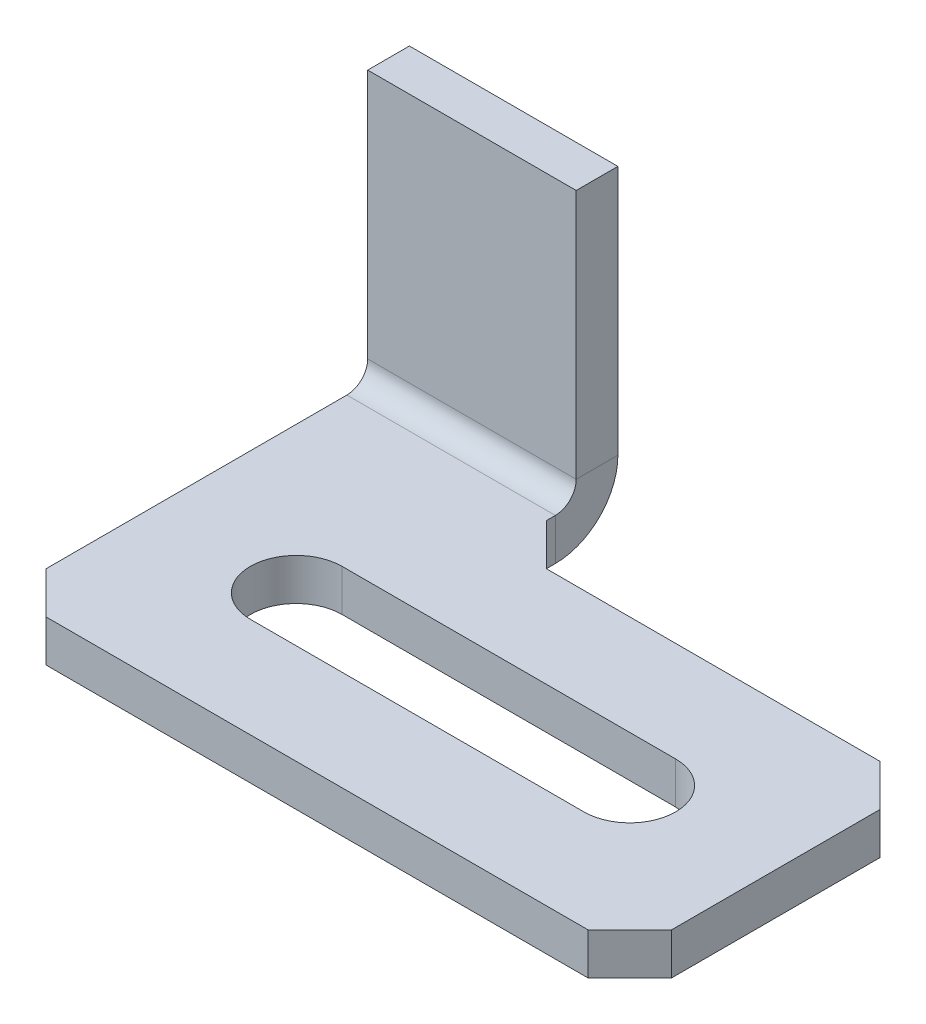
ISO-10303-21;
HEADER;
FILE_DESCRIPTION(('STEP AP214'),'2;1');
FILE_NAME('part.step','',(''),(''),'','','');
FILE_SCHEMA(('AUTOMOTIVE_DESIGN { 1 0 10303 214 1 1 1 1 }'));
ENDSEC;
DATA;
#1=APPLICATION_CONTEXT('core data for automotive mechanical design processes');
#2=APPLICATION_PROTOCOL_DEFINITION('international standard','automotive_design',2000,#1);
#3=PRODUCT_CONTEXT('',#1,'mechanical');
#4=PRODUCT('Part','Part','',(#3));
#5=PRODUCT_RELATED_PRODUCT_CATEGORY('part','',(#4));
#6=PRODUCT_DEFINITION_FORMATION('','',#4);
#7=PRODUCT_DEFINITION_CONTEXT('part definition',#1,'design');
#8=PRODUCT_DEFINITION('design','',#6,#7);
#9=PRODUCT_DEFINITION_SHAPE('','',#8);
#10=(LENGTH_UNIT() NAMED_UNIT(*) SI_UNIT(.MILLI.,.METRE.));
#11=(NAMED_UNIT(*) PLANE_ANGLE_UNIT() SI_UNIT($,.RADIAN.));
#12=(NAMED_UNIT(*) SI_UNIT($,.STERADIAN.) SOLID_ANGLE_UNIT());
#13=UNCERTAINTY_MEASURE_WITH_UNIT(LENGTH_MEASURE(1.E-05),#10,'distance_accuracy_value','');
#14=(GEOMETRIC_REPRESENTATION_CONTEXT(3) GLOBAL_UNCERTAINTY_ASSIGNED_CONTEXT((#13)) GLOBAL_UNIT_ASSIGNED_CONTEXT((#10,
#11,#12)) REPRESENTATION_CONTEXT('',''));
#15=CARTESIAN_POINT('',(0.,0.,0.));
#16=DIRECTION('',(0.,0.,1.));
#17=DIRECTION('',(1.,0.,0.));
#18=AXIS2_PLACEMENT_3D('',#15,#16,#17);
#19=CARTESIAN_POINT('',(7.5,-9.28539816339744,-9.71460183660258));
#20=DIRECTION('',(0.,0.,1.));
#21=DIRECTION('',(0.,-1.,0.));
#22=AXIS2_PLACEMENT_3D('',#19,#20,#21);
#23=PLANE('',#22);
#24=DIRECTION('',(-1.,0.,0.));
#25=VECTOR('',#24,1.);
#26=CARTESIAN_POINT('',(7.5,6.5,-9.71460183660253));
#27=LINE('',#26,#25);
#28=CARTESIAN_POINT('',(-2.5,6.5,-9.71460183660255));
#29=VERTEX_POINT('',#28);
#30=CARTESIAN_POINT('',(-7.5,6.5,-9.71460183660253));
#31=VERTEX_POINT('',#30);
#32=EDGE_CURVE('E141',#29,#31,#27,.T.);
#33=ORIENTED_EDGE('',*,*,#32,.F.);
#34=DIRECTION('',(0.,1.,0.));
#35=VECTOR('',#34,1.);
#36=CARTESIAN_POINT('',(-2.5,-9.28539816339745,-9.71460183660258));
#37=LINE('',#36,#35);
#38=CARTESIAN_POINT('',(-2.5,0.500000000000006,-9.71460183660255));
#39=VERTEX_POINT('',#38);
#40=EDGE_CURVE('E149',#39,#29,#37,.T.);
#41=ORIENTED_EDGE('',*,*,#40,.F.);
#42=DIRECTION('',(-1.,0.,0.));
#43=VECTOR('',#42,1.);
#44=CARTESIAN_POINT('',(7.5,0.500000000000006,-9.71460183660255));
#45=LINE('',#44,#43);
#46=CARTESIAN_POINT('',(-7.5,0.5,-9.71460183660255));
#47=VERTEX_POINT('',#46);
#48=EDGE_CURVE('E166',#39,#47,#45,.T.);
#49=ORIENTED_EDGE('',*,*,#48,.T.);
#50=DIRECTION('',(0.,1.,0.));
#51=VECTOR('',#50,1.);
#52=CARTESIAN_POINT('',(-7.5,-9.28539816339745,-9.71460183660258));
#53=LINE('',#52,#51);
#54=EDGE_CURVE('E151',#47,#31,#53,.T.);
#55=ORIENTED_EDGE('',*,*,#54,.T.);
#56=EDGE_LOOP('',(#33,#41,#49,#55));
#57=FACE_BOUND('',#56,.T.);
#58=ADVANCED_FACE('F17',(#57),#23,.F.);
#59=CARTESIAN_POINT('',(7.5,-9.28539816339745,-8.71460183660258));
#60=DIRECTION('',(0.,0.,1.));
#61=DIRECTION('',(0.,-1.,0.));
#62=AXIS2_PLACEMENT_3D('',#59,#60,#61);
#63=PLANE('',#62);
#64=DIRECTION('',(0.,1.,0.));
#65=VECTOR('',#64,1.);
#66=CARTESIAN_POINT('',(-2.5,-9.28539816339745,-8.71460183660258));
#67=LINE('',#66,#65);
#68=CARTESIAN_POINT('',(-2.5,0.5,-8.71460183660255));
#69=VERTEX_POINT('',#68);
#70=CARTESIAN_POINT('',(-2.5,6.5,-8.71460183660253));
#71=VERTEX_POINT('',#70);
#72=EDGE_CURVE('E165',#69,#71,#67,.T.);
#73=ORIENTED_EDGE('',*,*,#72,.T.);
#74=DIRECTION('',(-1.,0.,0.));
#75=VECTOR('',#74,1.);
#76=CARTESIAN_POINT('',(7.5,6.5,-8.71460183660253));
#77=LINE('',#76,#75);
#78=CARTESIAN_POINT('',(-7.5,6.5,-8.71460183660253));
#79=VERTEX_POINT('',#78);
#80=EDGE_CURVE('E32',#71,#79,#77,.T.);
#81=ORIENTED_EDGE('',*,*,#80,.T.);
#82=DIRECTION('',(0.,1.,0.));
#83=VECTOR('',#82,1.);
#84=CARTESIAN_POINT('',(-7.5,20.7146018366025,-8.71460183660248));
#85=LINE('',#84,#83);
#86=CARTESIAN_POINT('',(-7.5,0.5,-8.71460183660255));
#87=VERTEX_POINT('',#86);
#88=EDGE_CURVE('E38',#87,#79,#85,.T.);
#89=ORIENTED_EDGE('',*,*,#88,.F.);
#90=DIRECTION('',(-1.,0.,0.));
#91=VECTOR('',#90,1.);
#92=CARTESIAN_POINT('',(7.5,0.5,-8.71460183660255));
#93=LINE('',#92,#91);
#94=EDGE_CURVE('E170',#69,#87,#93,.T.);
#95=ORIENTED_EDGE('',*,*,#94,.F.);
#96=EDGE_LOOP('',(#73,#81,#89,#95));
#97=FACE_BOUND('',#96,.T.);
#98=ADVANCED_FACE('F332',(#97),#63,.T.);
#99=CARTESIAN_POINT('',(-7.5,20.7146018366025,-9.71460183660248));
#100=DIRECTION('',(-1.,0.,0.));
#101=DIRECTION('',(0.,1.,0.));
#102=AXIS2_PLACEMENT_3D('',#99,#100,#101);
#103=PLANE('',#102);
#104=ORIENTED_EDGE('',*,*,#88,.T.);
#105=DIRECTION('',(0.,0.,-1.));
#106=VECTOR('',#105,1.);
#107=CARTESIAN_POINT('',(-7.5,6.5,-9.71460183660248));
#108=LINE('',#107,#106);
#109=EDGE_CURVE('E152',#79,#31,#108,.T.);
#110=ORIENTED_EDGE('',*,*,#109,.T.);
#111=ORIENTED_EDGE('',*,*,#54,.F.);
#112=DIRECTION('',(0.,0.,-1.));
#113=VECTOR('',#112,1.);
#114=CARTESIAN_POINT('',(-7.5,0.500000000000006,-9.71460183660255));
#115=LINE('',#114,#113);
#116=EDGE_CURVE('E25',#87,#47,#115,.T.);
#117=ORIENTED_EDGE('',*,*,#116,.F.);
#118=EDGE_LOOP('',(#104,#110,#111,#117));
#119=FACE_BOUND('',#118,.T.);
#120=ADVANCED_FACE('F19',(#119),#103,.T.);
#121=CARTESIAN_POINT('',(-2.5,20.7146018366024,33.2303025023038));
#122=DIRECTION('',(1.,0.,0.));
#123=DIRECTION('',(0.,1.,0.));
#124=AXIS2_PLACEMENT_3D('',#121,#122,#123);
#125=PLANE('',#124);
#126=ORIENTED_EDGE('',*,*,#40,.T.);
#127=DIRECTION('',(0.,0.,1.));
#128=VECTOR('',#127,1.);
#129=CARTESIAN_POINT('',(-2.5,6.5,33.2303025023038));
#130=LINE('',#129,#128);
#131=EDGE_CURVE('E11',#29,#71,#130,.T.);
#132=ORIENTED_EDGE('',*,*,#131,.T.);
#133=ORIENTED_EDGE('',*,*,#72,.F.);
#134=DIRECTION('',(0.,0.,1.));
#135=VECTOR('',#134,1.);
#136=CARTESIAN_POINT('',(-2.5,0.49999999999986,33.2303025023038));
#137=LINE('',#136,#135);
#138=EDGE_CURVE('E156',#39,#69,#137,.T.);
#139=ORIENTED_EDGE('',*,*,#138,.F.);
#140=EDGE_LOOP('',(#126,#132,#133,#139));
#141=FACE_BOUND('',#140,.T.);
#142=ADVANCED_FACE('F154',(#141),#125,.T.);
#143=CARTESIAN_POINT('',(4.,-1.,-3.5));
#144=DIRECTION('',(0.,1.,0.));
#145=DIRECTION('',(0.,0.,1.));
#146=AXIS2_PLACEMENT_3D('',#143,#144,#145);
#147=CYLINDRICAL_SURFACE('',#146,1.1);
#148=CARTESIAN_POINT('',(4.,0.,-3.5));
#149=DIRECTION('',(0.,1.,0.));
#150=DIRECTION('',(0.,0.,1.));
#151=AXIS2_PLACEMENT_3D('',#148,#149,#150);
#152=CIRCLE('',#151,1.1);
#153=CARTESIAN_POINT('',(4.,0.,-2.4));
#154=VERTEX_POINT('',#153);
#155=CARTESIAN_POINT('',(4.,0.,-4.6));
#156=VERTEX_POINT('',#155);
#157=EDGE_CURVE('E194',#154,#156,#152,.T.);
#158=ORIENTED_EDGE('',*,*,#157,.T.);
#159=DIRECTION('',(0.,1.,0.));
#160=VECTOR('',#159,1.);
#161=CARTESIAN_POINT('',(4.,-1.,-4.6));
#162=LINE('',#161,#160);
#163=CARTESIAN_POINT('',(4.,-1.,-4.6));
#164=VERTEX_POINT('',#163);
#165=EDGE_CURVE('E282',#164,#156,#162,.T.);
#166=ORIENTED_EDGE('',*,*,#165,.F.);
#167=CARTESIAN_POINT('',(4.,-1.,-3.5));
#168=DIRECTION('',(0.,1.,0.));
#169=DIRECTION('',(0.,0.,1.));
#170=AXIS2_PLACEMENT_3D('',#167,#168,#169);
#171=CIRCLE('',#170,1.1);
#172=CARTESIAN_POINT('',(4.,-1.,-2.4));
#173=VERTEX_POINT('',#172);
#174=EDGE_CURVE('E241',#173,#164,#171,.T.);
#175=ORIENTED_EDGE('',*,*,#174,.F.);
#176=DIRECTION('',(0.,1.,0.));
#177=VECTOR('',#176,1.);
#178=CARTESIAN_POINT('',(4.,-1.,-2.4));
#179=LINE('',#178,#177);
#180=EDGE_CURVE('E297',#173,#154,#179,.T.);
#181=ORIENTED_EDGE('',*,*,#180,.T.);
#182=EDGE_LOOP('',(#158,#166,#175,#181));
#183=FACE_BOUND('',#182,.T.);
#184=ADVANCED_FACE('F303',(#183),#147,.F.);
#185=CARTESIAN_POINT('',(-4.,-1.,-2.4));
#186=DIRECTION('',(0.,0.,1.));
#187=DIRECTION('',(1.,0.,0.));
#188=AXIS2_PLACEMENT_3D('',#185,#186,#187);
#189=PLANE('',#188);
#190=DIRECTION('',(1.,0.,0.));
#191=VECTOR('',#190,1.);
#192=CARTESIAN_POINT('',(-4.,-1.,-2.4));
#193=LINE('',#192,#191);
#194=CARTESIAN_POINT('',(-4.,-1.,-2.4));
#195=VERTEX_POINT('',#194);
#196=EDGE_CURVE('E244',#195,#173,#193,.T.);
#197=ORIENTED_EDGE('',*,*,#196,.F.);
#198=DIRECTION('',(0.,1.,0.));
#199=VECTOR('',#198,1.);
#200=CARTESIAN_POINT('',(-4.,-1.,-2.4));
#201=LINE('',#200,#199);
#202=CARTESIAN_POINT('',(-4.,0.,-2.4));
#203=VERTEX_POINT('',#202);
#204=EDGE_CURVE('E294',#195,#203,#201,.T.);
#205=ORIENTED_EDGE('',*,*,#204,.T.);
#206=DIRECTION('',(1.,0.,0.));
#207=VECTOR('',#206,1.);
#208=CARTESIAN_POINT('',(7.5,0.,-2.4));
#209=LINE('',#208,#207);
#210=EDGE_CURVE('E292',#203,#154,#209,.T.);
#211=ORIENTED_EDGE('',*,*,#210,.T.);
#212=ORIENTED_EDGE('',*,*,#180,.F.);
#213=EDGE_LOOP('',(#197,#205,#211,#212));
#214=FACE_BOUND('',#213,.T.);
#215=ADVANCED_FACE('F320',(#214),#189,.F.);
#216=CARTESIAN_POINT('',(-4.,-1.,-3.5));
#217=DIRECTION('',(0.,1.,0.));
#218=DIRECTION('',(0.,0.,1.));
#219=AXIS2_PLACEMENT_3D('',#216,#217,#218);
#220=CYLINDRICAL_SURFACE('',#219,1.1);
#221=CARTESIAN_POINT('',(-4.,0.,-3.5));
#222=DIRECTION('',(0.,-1.,0.));
#223=DIRECTION('',(0.,0.,1.));
#224=AXIS2_PLACEMENT_3D('',#221,#222,#223);
#225=CIRCLE('',#224,1.1);
#226=CARTESIAN_POINT('',(-4.,0.,-4.6));
#227=VERTEX_POINT('',#226);
#228=EDGE_CURVE('E229',#203,#227,#225,.T.);
#229=ORIENTED_EDGE('',*,*,#228,.F.);
#230=ORIENTED_EDGE('',*,*,#204,.F.);
#231=CARTESIAN_POINT('',(-4.,-1.,-3.5));
#232=DIRECTION('',(0.,-1.,0.));
#233=DIRECTION('',(0.,0.,1.));
#234=AXIS2_PLACEMENT_3D('',#231,#232,#233);
#235=CIRCLE('',#234,1.1);
#236=CARTESIAN_POINT('',(-4.,-1.,-4.6));
#237=VERTEX_POINT('',#236);
#238=EDGE_CURVE('E289',#195,#237,#235,.T.);
#239=ORIENTED_EDGE('',*,*,#238,.T.);
#240=DIRECTION('',(0.,1.,0.));
#241=VECTOR('',#240,1.);
#242=CARTESIAN_POINT('',(-4.,-1.,-4.6));
#243=LINE('',#242,#241);
#244=EDGE_CURVE('E286',#237,#227,#243,.T.);
#245=ORIENTED_EDGE('',*,*,#244,.T.);
#246=EDGE_LOOP('',(#229,#230,#239,#245));
#247=FACE_BOUND('',#246,.T.);
#248=ADVANCED_FACE('F314',(#247),#220,.F.);
#249=CARTESIAN_POINT('',(-4.,-1.,-4.6));
#250=DIRECTION('',(0.,0.,-1.));
#251=DIRECTION('',(-1.,0.,0.));
#252=AXIS2_PLACEMENT_3D('',#249,#250,#251);
#253=PLANE('',#252);
#254=DIRECTION('',(-1.,0.,0.));
#255=VECTOR('',#254,1.);
#256=CARTESIAN_POINT('',(-4.,0.,-4.6));
#257=LINE('',#256,#255);
#258=EDGE_CURVE('E284',#156,#227,#257,.T.);
#259=ORIENTED_EDGE('',*,*,#258,.T.);
#260=ORIENTED_EDGE('',*,*,#244,.F.);
#261=DIRECTION('',(-1.,0.,0.));
#262=VECTOR('',#261,1.);
#263=CARTESIAN_POINT('',(-4.,-1.,-4.6));
#264=LINE('',#263,#262);
#265=EDGE_CURVE('E247',#164,#237,#264,.T.);
#266=ORIENTED_EDGE('',*,*,#265,.F.);
#267=ORIENTED_EDGE('',*,*,#165,.T.);
#268=EDGE_LOOP('',(#259,#260,#266,#267));
#269=FACE_BOUND('',#268,.T.);
#270=ADVANCED_FACE('F312',(#269),#253,.F.);
#271=CARTESIAN_POINT('',(-7.5,-1.,-1.));
#272=DIRECTION('',(0.707106781186547,0.,-0.707106781186549));
#273=DIRECTION('',(-0.707106781186549,0.,-0.707106781186546));
#274=AXIS2_PLACEMENT_3D('',#271,#272,#273);
#275=PLANE('',#274);
#276=DIRECTION('',(0.707106781186549,0.,0.707106781186546));
#277=VECTOR('',#276,1.);
#278=CARTESIAN_POINT('',(-7.5,-1.,-1.));
#279=LINE('',#278,#277);
#280=CARTESIAN_POINT('',(-6.5,-1.,0.));
#281=VERTEX_POINT('',#280);
#282=CARTESIAN_POINT('',(-7.5,-1.,-1.));
#283=VERTEX_POINT('',#282);
#284=EDGE_CURVE('E251',#281,#283,#279,.F.);
#285=ORIENTED_EDGE('',*,*,#284,.F.);
#286=DIRECTION('',(0.,-1.,0.));
#287=VECTOR('',#286,1.);
#288=CARTESIAN_POINT('',(-6.5,-1.,0.));
#289=LINE('',#288,#287);
#290=CARTESIAN_POINT('',(-6.5,0.,0.));
#291=VERTEX_POINT('',#290);
#292=EDGE_CURVE('E280',#291,#281,#289,.T.);
#293=ORIENTED_EDGE('',*,*,#292,.F.);
#294=DIRECTION('',(-0.707106781186549,0.,-0.707106781186546));
#295=VECTOR('',#294,1.);
#296=CARTESIAN_POINT('',(0.50000000000003,0.,7.));
#297=LINE('',#296,#295);
#298=CARTESIAN_POINT('',(-7.5,0.,-1.00000000000002));
#299=VERTEX_POINT('',#298);
#300=EDGE_CURVE('E221',#299,#291,#297,.F.);
#301=ORIENTED_EDGE('',*,*,#300,.F.);
#302=DIRECTION('',(0.,1.,0.));
#303=VECTOR('',#302,1.);
#304=CARTESIAN_POINT('',(-7.5,-1.,-1.));
#305=LINE('',#304,#303);
#306=EDGE_CURVE('E158',#283,#299,#305,.T.);
#307=ORIENTED_EDGE('',*,*,#306,.F.);
#308=EDGE_LOOP('',(#285,#293,#301,#307));
#309=FACE_BOUND('',#308,.T.);
#310=ADVANCED_FACE('F388',(#309),#275,.F.);
#311=CARTESIAN_POINT('',(0.,-1.,0.));
#312=DIRECTION('',(0.,0.,1.));
#313=DIRECTION('',(1.,0.,0.));
#314=AXIS2_PLACEMENT_3D('',#311,#312,#313);
#315=PLANE('',#314);
#316=DIRECTION('',(1.,0.,0.));
#317=VECTOR('',#316,1.);
#318=CARTESIAN_POINT('',(0.,0.,0.));
#319=LINE('',#318,#317);
#320=CARTESIAN_POINT('',(6.5,0.,0.));
#321=VERTEX_POINT('',#320);
#322=EDGE_CURVE('E218',#291,#321,#319,.T.);
#323=ORIENTED_EDGE('',*,*,#322,.F.);
#324=ORIENTED_EDGE('',*,*,#292,.T.);
#325=DIRECTION('',(1.,0.,0.));
#326=VECTOR('',#325,1.);
#327=CARTESIAN_POINT('',(0.,-1.,0.));
#328=LINE('',#327,#326);
#329=CARTESIAN_POINT('',(6.5,-1.,0.));
#330=VERTEX_POINT('',#329);
#331=EDGE_CURVE('E277',#281,#330,#328,.T.);
#332=ORIENTED_EDGE('',*,*,#331,.T.);
#333=DIRECTION('',(0.,1.,0.));
#334=VECTOR('',#333,1.);
#335=CARTESIAN_POINT('',(6.5,-1.,0.));
#336=LINE('',#335,#334);
#337=EDGE_CURVE('E274',#330,#321,#336,.T.);
#338=ORIENTED_EDGE('',*,*,#337,.T.);
#339=EDGE_LOOP('',(#323,#324,#332,#338));
#340=FACE_BOUND('',#339,.T.);
#341=ADVANCED_FACE('F398',(#340),#315,.T.);
#342=CARTESIAN_POINT('',(6.5,-1.,0.));
#343=DIRECTION('',(-0.707106781186549,0.,-0.707106781186547));
#344=DIRECTION('',(-0.707106781186546,0.,0.707106781186549));
#345=AXIS2_PLACEMENT_3D('',#342,#343,#344);
#346=PLANE('',#345);
#347=DIRECTION('',(0.707106781186546,0.,-0.707106781186549));
#348=VECTOR('',#347,1.);
#349=CARTESIAN_POINT('',(6.5,-1.,0.));
#350=LINE('',#349,#348);
#351=CARTESIAN_POINT('',(7.5,-1.,-1.));
#352=VERTEX_POINT('',#351);
#353=EDGE_CURVE('E253',#352,#330,#350,.F.);
#354=ORIENTED_EDGE('',*,*,#353,.F.);
#355=DIRECTION('',(0.,-1.,0.));
#356=VECTOR('',#355,1.);
#357=CARTESIAN_POINT('',(7.5,-1.,-1.));
#358=LINE('',#357,#356);
#359=CARTESIAN_POINT('',(7.5,0.,-1.));
#360=VERTEX_POINT('',#359);
#361=EDGE_CURVE('E272',#360,#352,#358,.T.);
#362=ORIENTED_EDGE('',*,*,#361,.F.);
#363=DIRECTION('',(-0.707106781186546,0.,0.707106781186549));
#364=VECTOR('',#363,1.);
#365=CARTESIAN_POINT('',(7.,0.,-0.5));
#366=LINE('',#365,#364);
#367=EDGE_CURVE('E216',#321,#360,#366,.F.);
#368=ORIENTED_EDGE('',*,*,#367,.F.);
#369=ORIENTED_EDGE('',*,*,#337,.F.);
#370=EDGE_LOOP('',(#354,#362,#368,#369));
#371=FACE_BOUND('',#370,.T.);
#372=ADVANCED_FACE('F408',(#371),#346,.F.);
#373=CARTESIAN_POINT('',(7.5,-1.,-30.));
#374=DIRECTION('',(1.,0.,0.));
#375=DIRECTION('',(0.,0.,-1.));
#376=AXIS2_PLACEMENT_3D('',#373,#374,#375);
#377=PLANE('',#376);
#378=DIRECTION('',(0.,0.,-1.));
#379=VECTOR('',#378,1.);
#380=CARTESIAN_POINT('',(7.5,0.,-30.));
#381=LINE('',#380,#379);
#382=CARTESIAN_POINT('',(7.5,0.,-6.));
#383=VERTEX_POINT('',#382);
#384=EDGE_CURVE('E213',#360,#383,#381,.T.);
#385=ORIENTED_EDGE('',*,*,#384,.F.);
#386=ORIENTED_EDGE('',*,*,#361,.T.);
#387=DIRECTION('',(0.,0.,-1.));
#388=VECTOR('',#387,1.);
#389=CARTESIAN_POINT('',(7.5,-1.,0.));
#390=LINE('',#389,#388);
#391=CARTESIAN_POINT('',(7.5,-1.,-6.));
#392=VERTEX_POINT('',#391);
#393=EDGE_CURVE('E269',#352,#392,#390,.T.);
#394=ORIENTED_EDGE('',*,*,#393,.T.);
#395=DIRECTION('',(0.,1.,0.));
#396=VECTOR('',#395,1.);
#397=CARTESIAN_POINT('',(7.5,-1.,-6.));
#398=LINE('',#397,#396);
#399=EDGE_CURVE('E267',#392,#383,#398,.T.);
#400=ORIENTED_EDGE('',*,*,#399,.T.);
#401=EDGE_LOOP('',(#385,#386,#394,#400));
#402=FACE_BOUND('',#401,.T.);
#403=ADVANCED_FACE('F418',(#402),#377,.T.);
#404=CARTESIAN_POINT('',(6.5,41.9449043389063,-7.));
#405=DIRECTION('',(-0.707106781186549,0.,0.707106781186547));
#406=DIRECTION('',(0.707106781186547,0.,0.707106781186549));
#407=AXIS2_PLACEMENT_3D('',#404,#405,#406);
#408=PLANE('',#407);
#409=DIRECTION('',(0.707106781186547,0.,0.707106781186549));
#410=VECTOR('',#409,1.);
#411=CARTESIAN_POINT('',(10.5,0.,-3.));
#412=LINE('',#411,#410);
#413=CARTESIAN_POINT('',(6.5,0.,-7.));
#414=VERTEX_POINT('',#413);
#415=EDGE_CURVE('E211',#383,#414,#412,.F.);
#416=ORIENTED_EDGE('',*,*,#415,.F.);
#417=ORIENTED_EDGE('',*,*,#399,.F.);
#418=DIRECTION('',(-0.707106781186547,0.,-0.707106781186549));
#419=VECTOR('',#418,1.);
#420=CARTESIAN_POINT('',(6.5,-1.,-7.));
#421=LINE('',#420,#419);
#422=CARTESIAN_POINT('',(6.5,-1.,-7.));
#423=VERTEX_POINT('',#422);
#424=EDGE_CURVE('E255',#423,#392,#421,.F.);
#425=ORIENTED_EDGE('',*,*,#424,.F.);
#426=DIRECTION('',(0.,-1.,0.));
#427=VECTOR('',#426,1.);
#428=CARTESIAN_POINT('',(6.5,41.9449043389063,-7.));
#429=LINE('',#428,#427);
#430=EDGE_CURVE('E264',#414,#423,#429,.T.);
#431=ORIENTED_EDGE('',*,*,#430,.F.);
#432=EDGE_LOOP('',(#416,#417,#425,#431));
#433=FACE_BOUND('',#432,.T.);
#434=ADVANCED_FACE('F428',(#433),#408,.F.);
#435=CARTESIAN_POINT('',(-2.5,41.9449043389063,-7.));
#436=DIRECTION('',(0.,0.,-1.));
#437=DIRECTION('',(-1.,0.,0.));
#438=AXIS2_PLACEMENT_3D('',#435,#436,#437);
#439=PLANE('',#438);
#440=DIRECTION('',(-1.,0.,0.));
#441=VECTOR('',#440,1.);
#442=CARTESIAN_POINT('',(7.5,0.,-7.));
#443=LINE('',#442,#441);
#444=CARTESIAN_POINT('',(-1.5,0.,-7.));
#445=VERTEX_POINT('',#444);
#446=EDGE_CURVE('E208',#414,#445,#443,.T.);
#447=ORIENTED_EDGE('',*,*,#446,.F.);
#448=ORIENTED_EDGE('',*,*,#430,.T.);
#449=DIRECTION('',(-1.,0.,0.));
#450=VECTOR('',#449,1.);
#451=CARTESIAN_POINT('',(7.5,-1.,-7.));
#452=LINE('',#451,#450);
#453=CARTESIAN_POINT('',(-1.5,-1.,-7.));
#454=VERTEX_POINT('',#453);
#455=EDGE_CURVE('E261',#423,#454,#452,.T.);
#456=ORIENTED_EDGE('',*,*,#455,.T.);
#457=DIRECTION('',(0.,1.,0.));
#458=VECTOR('',#457,1.);
#459=CARTESIAN_POINT('',(-1.5,0.,-7.));
#460=LINE('',#459,#458);
#461=EDGE_CURVE('E259',#454,#445,#460,.T.);
#462=ORIENTED_EDGE('',*,*,#461,.T.);
#463=EDGE_LOOP('',(#447,#448,#456,#462));
#464=FACE_BOUND('',#463,.T.);
#465=ADVANCED_FACE('F438',(#464),#439,.T.);
#466=CARTESIAN_POINT('',(-2.5,41.9449043389063,-8.));
#467=DIRECTION('',(0.707106781186552,0.,-0.707106781186544));
#468=DIRECTION('',(-0.707106781186544,0.,-0.707106781186552));
#469=AXIS2_PLACEMENT_3D('',#466,#467,#468);
#470=PLANE('',#469);
#471=DIRECTION('',(0.707106781186544,0.,0.707106781186552));
#472=VECTOR('',#471,1.);
#473=CARTESIAN_POINT('',(-2.5,0.,-8.));
#474=LINE('',#473,#472);
#475=CARTESIAN_POINT('',(-2.5,0.,-8.));
#476=VERTEX_POINT('',#475);
#477=EDGE_CURVE('E206',#445,#476,#474,.F.);
#478=ORIENTED_EDGE('',*,*,#477,.F.);
#479=ORIENTED_EDGE('',*,*,#461,.F.);
#480=DIRECTION('',(-0.707106781186544,0.,-0.707106781186552));
#481=VECTOR('',#480,1.);
#482=CARTESIAN_POINT('',(6.5,-1.,1.00000000000004));
#483=LINE('',#482,#481);
#484=CARTESIAN_POINT('',(-2.5,-1.,-8.));
#485=VERTEX_POINT('',#484);
#486=EDGE_CURVE('E257',#485,#454,#483,.F.);
#487=ORIENTED_EDGE('',*,*,#486,.F.);
#488=DIRECTION('',(0.,-1.,0.));
#489=VECTOR('',#488,1.);
#490=CARTESIAN_POINT('',(-2.5,-1.,-8.));
#491=LINE('',#490,#489);
#492=EDGE_CURVE('E232',#476,#485,#491,.T.);
#493=ORIENTED_EDGE('',*,*,#492,.F.);
#494=EDGE_LOOP('',(#478,#479,#487,#493));
#495=FACE_BOUND('',#494,.T.);
#496=ADVANCED_FACE('F448',(#495),#470,.T.);
#497=CARTESIAN_POINT('',(7.5,-1.,0.));
#498=DIRECTION('',(0.,1.,0.));
#499=DIRECTION('',(0.,0.,1.));
#500=AXIS2_PLACEMENT_3D('',#497,#498,#499);
#501=PLANE('',#500);
#502=DIRECTION('',(-1.,0.,0.));
#503=VECTOR('',#502,1.);
#504=CARTESIAN_POINT('',(7.5,-1.,-8.21460183660255));
#505=LINE('',#504,#503);
#506=CARTESIAN_POINT('',(-2.5,-1.,-8.21460183660255));
#507=VERTEX_POINT('',#506);
#508=CARTESIAN_POINT('',(-7.5,-1.,-8.21460183660255));
#509=VERTEX_POINT('',#508);
#510=EDGE_CURVE('E173',#507,#509,#505,.T.);
#511=ORIENTED_EDGE('',*,*,#510,.F.);
#512=DIRECTION('',(0.,0.,-1.));
#513=VECTOR('',#512,1.);
#514=CARTESIAN_POINT('',(-2.5,-1.,0.));
#515=LINE('',#514,#513);
#516=EDGE_CURVE('E238',#485,#507,#515,.T.);
#517=ORIENTED_EDGE('',*,*,#516,.F.);
#518=ORIENTED_EDGE('',*,*,#486,.T.);
#519=ORIENTED_EDGE('',*,*,#455,.F.);
#520=ORIENTED_EDGE('',*,*,#424,.T.);
#521=ORIENTED_EDGE('',*,*,#393,.F.);
#522=ORIENTED_EDGE('',*,*,#353,.T.);
#523=ORIENTED_EDGE('',*,*,#331,.F.);
#524=ORIENTED_EDGE('',*,*,#284,.T.);
#525=DIRECTION('',(0.,0.,-1.));
#526=VECTOR('',#525,1.);
#527=CARTESIAN_POINT('',(-7.5,-1.,0.));
#528=LINE('',#527,#526);
#529=EDGE_CURVE('E249',#283,#509,#528,.T.);
#530=ORIENTED_EDGE('',*,*,#529,.T.);
#531=EDGE_LOOP('',(#511,#517,#518,#519,#520,#521,#522,#523,#524,#530));
#532=FACE_BOUND('',#531,.T.);
#533=ORIENTED_EDGE('',*,*,#265,.T.);
#534=ORIENTED_EDGE('',*,*,#238,.F.);
#535=ORIENTED_EDGE('',*,*,#196,.T.);
#536=ORIENTED_EDGE('',*,*,#174,.T.);
#537=EDGE_LOOP('',(#533,#534,#535,#536));
#538=FACE_BOUND('',#537,.T.);
#539=ADVANCED_FACE('F318',(#532,#538),#501,.F.);
#540=CARTESIAN_POINT('',(-2.5,41.9449043389063,-30.));
#541=DIRECTION('',(1.,0.,0.));
#542=DIRECTION('',(0.,0.,-1.));
#543=AXIS2_PLACEMENT_3D('',#540,#541,#542);
#544=PLANE('',#543);
#545=ORIENTED_EDGE('',*,*,#516,.T.);
#546=DIRECTION('',(0.,1.,0.));
#547=VECTOR('',#546,1.);
#548=CARTESIAN_POINT('',(-2.5,41.9449043389063,-8.21460183660255));
#549=LINE('',#548,#547);
#550=CARTESIAN_POINT('',(-2.5,0.,-8.21460183660255));
#551=VERTEX_POINT('',#550);
#552=EDGE_CURVE('E235',#507,#551,#549,.T.);
#553=ORIENTED_EDGE('',*,*,#552,.T.);
#554=DIRECTION('',(0.,0.,-1.));
#555=VECTOR('',#554,1.);
#556=CARTESIAN_POINT('',(-2.5,0.,0.));
#557=LINE('',#556,#555);
#558=EDGE_CURVE('E226',#476,#551,#557,.T.);
#559=ORIENTED_EDGE('',*,*,#558,.F.);
#560=ORIENTED_EDGE('',*,*,#492,.T.);
#561=EDGE_LOOP('',(#545,#553,#559,#560));
#562=FACE_BOUND('',#561,.T.);
#563=ADVANCED_FACE('F467',(#562),#544,.T.);
#564=CARTESIAN_POINT('',(7.5,0.,0.));
#565=DIRECTION('',(0.,1.,0.));
#566=DIRECTION('',(0.,0.,1.));
#567=AXIS2_PLACEMENT_3D('',#564,#565,#566);
#568=PLANE('',#567);
#569=ORIENTED_EDGE('',*,*,#228,.T.);
#570=ORIENTED_EDGE('',*,*,#258,.F.);
#571=ORIENTED_EDGE('',*,*,#157,.F.);
#572=ORIENTED_EDGE('',*,*,#210,.F.);
#573=EDGE_LOOP('',(#569,#570,#571,#572));
#574=FACE_BOUND('',#573,.T.);
#575=ORIENTED_EDGE('',*,*,#558,.T.);
#576=DIRECTION('',(-1.,0.,0.));
#577=VECTOR('',#576,1.);
#578=CARTESIAN_POINT('',(7.5,0.,-8.21460183660255));
#579=LINE('',#578,#577);
#580=CARTESIAN_POINT('',(-7.5,0.,-8.21460183660255));
#581=VERTEX_POINT('',#580);
#582=EDGE_CURVE('E223',#551,#581,#579,.T.);
#583=ORIENTED_EDGE('',*,*,#582,.T.);
#584=DIRECTION('',(0.,0.,-1.));
#585=VECTOR('',#584,1.);
#586=CARTESIAN_POINT('',(-7.5,0.,-30.));
#587=LINE('',#586,#585);
#588=EDGE_CURVE('E203',#299,#581,#587,.T.);
#589=ORIENTED_EDGE('',*,*,#588,.F.);
#590=ORIENTED_EDGE('',*,*,#300,.T.);
#591=ORIENTED_EDGE('',*,*,#322,.T.);
#592=ORIENTED_EDGE('',*,*,#367,.T.);
#593=ORIENTED_EDGE('',*,*,#384,.T.);
#594=ORIENTED_EDGE('',*,*,#415,.T.);
#595=ORIENTED_EDGE('',*,*,#446,.T.);
#596=ORIENTED_EDGE('',*,*,#477,.T.);
#597=EDGE_LOOP('',(#575,#583,#589,#590,#591,#592,#593,#594,#595,#596));
#598=FACE_BOUND('',#597,.T.);
#599=ADVANCED_FACE('F307',(#574,#598),#568,.T.);
#600=CARTESIAN_POINT('',(-7.5,-1.,-30.));
#601=DIRECTION('',(-1.,0.,0.));
#602=DIRECTION('',(0.,0.,-1.));
#603=AXIS2_PLACEMENT_3D('',#600,#601,#602);
#604=PLANE('',#603);
#605=ORIENTED_EDGE('',*,*,#588,.T.);
#606=DIRECTION('',(0.,-1.,0.));
#607=VECTOR('',#606,1.);
#608=CARTESIAN_POINT('',(-7.5,-1.,-8.21460183660255));
#609=LINE('',#608,#607);
#610=EDGE_CURVE('E162',#581,#509,#609,.T.);
#611=ORIENTED_EDGE('',*,*,#610,.T.);
#612=ORIENTED_EDGE('',*,*,#529,.F.);
#613=ORIENTED_EDGE('',*,*,#306,.T.);
#614=EDGE_LOOP('',(#605,#611,#612,#613));
#615=FACE_BOUND('',#614,.T.);
#616=ADVANCED_FACE('F340',(#615),#604,.T.);
#617=CARTESIAN_POINT('',(-2.5,0.5,-8.21460183660255));
#618=DIRECTION('',(1.,0.,0.));
#619=DIRECTION('',(0.,0.,-1.));
#620=AXIS2_PLACEMENT_3D('',#617,#618,#619);
#621=PLANE('',#620);
#622=ORIENTED_EDGE('',*,*,#138,.T.);
#623=CARTESIAN_POINT('',(-2.5,0.5,-8.21460183660255));
#624=DIRECTION('',(1.,0.,0.));
#625=DIRECTION('',(0.,0.,-1.));
#626=AXIS2_PLACEMENT_3D('',#623,#624,#625);
#627=CIRCLE('',#626,0.5);
#628=EDGE_CURVE('E199',#69,#551,#627,.F.);
#629=ORIENTED_EDGE('',*,*,#628,.T.);
#630=ORIENTED_EDGE('',*,*,#552,.F.);
#631=CARTESIAN_POINT('',(-2.5,0.5,-8.21460183660255));
#632=DIRECTION('',(-1.,0.,0.));
#633=DIRECTION('',(0.,0.,-1.));
#634=AXIS2_PLACEMENT_3D('',#631,#632,#633);
#635=CIRCLE('',#634,1.5);
#636=EDGE_CURVE('E192',#39,#507,#635,.T.);
#637=ORIENTED_EDGE('',*,*,#636,.F.);
#638=EDGE_LOOP('',(#622,#629,#630,#637));
#639=FACE_BOUND('',#638,.T.);
#640=ADVANCED_FACE('F493',(#639),#621,.T.);
#641=CARTESIAN_POINT('',(-7.5,0.5,-8.21460183660255));
#642=DIRECTION('',(-1.,0.,0.));
#643=DIRECTION('',(0.,0.,1.));
#644=AXIS2_PLACEMENT_3D('',#641,#642,#643);
#645=PLANE('',#644);
#646=ORIENTED_EDGE('',*,*,#610,.F.);
#647=CARTESIAN_POINT('',(-7.5,0.5,-8.21460183660255));
#648=DIRECTION('',(1.,0.,0.));
#649=DIRECTION('',(0.,0.,-1.));
#650=AXIS2_PLACEMENT_3D('',#647,#648,#649);
#651=CIRCLE('',#650,0.5);
#652=EDGE_CURVE('E186',#581,#87,#651,.T.);
#653=ORIENTED_EDGE('',*,*,#652,.T.);
#654=ORIENTED_EDGE('',*,*,#116,.T.);
#655=CARTESIAN_POINT('',(-7.5,0.5,-8.21460183660255));
#656=DIRECTION('',(1.,0.,0.));
#657=DIRECTION('',(0.,0.,-1.));
#658=AXIS2_PLACEMENT_3D('',#655,#656,#657);
#659=CIRCLE('',#658,1.5);
#660=EDGE_CURVE('E183',#509,#47,#659,.T.);
#661=ORIENTED_EDGE('',*,*,#660,.F.);
#662=EDGE_LOOP('',(#646,#653,#654,#661));
#663=FACE_BOUND('',#662,.T.);
#664=ADVANCED_FACE('F182',(#663),#645,.T.);
#665=CARTESIAN_POINT('',(-10.3354850857511,0.5,-8.21460183660255));
#666=DIRECTION('',(1.,0.,0.));
#667=DIRECTION('',(0.,0.,-1.));
#668=AXIS2_PLACEMENT_3D('',#665,#666,#667);
#669=CYLINDRICAL_SURFACE('',#668,1.5);
#670=ORIENTED_EDGE('',*,*,#660,.T.);
#671=ORIENTED_EDGE('',*,*,#48,.F.);
#672=ORIENTED_EDGE('',*,*,#636,.T.);
#673=ORIENTED_EDGE('',*,*,#510,.T.);
#674=EDGE_LOOP('',(#670,#671,#672,#673));
#675=FACE_BOUND('',#674,.T.);
#676=ADVANCED_FACE('F189',(#675),#669,.T.);
#677=CARTESIAN_POINT('',(-10.3354850857511,0.5,-8.21460183660255));
#678=DIRECTION('',(1.,0.,0.));
#679=DIRECTION('',(0.,0.,-1.));
#680=AXIS2_PLACEMENT_3D('',#677,#678,#679);
#681=CYLINDRICAL_SURFACE('',#680,0.5);
#682=ORIENTED_EDGE('',*,*,#652,.F.);
#683=ORIENTED_EDGE('',*,*,#582,.F.);
#684=ORIENTED_EDGE('',*,*,#628,.F.);
#685=ORIENTED_EDGE('',*,*,#94,.T.);
#686=EDGE_LOOP('',(#682,#683,#684,#685));
#687=FACE_BOUND('',#686,.T.);
#688=ADVANCED_FACE('F518',(#687),#681,.F.);
#689=CARTESIAN_POINT('',(1.55262957207901,6.5,-47.2968754590806));
#690=DIRECTION('',(0.,1.,0.));
#691=DIRECTION('',(0.,0.,1.));
#692=AXIS2_PLACEMENT_3D('',#689,#690,#691);
#693=PLANE('',#692);
#694=ORIENTED_EDGE('',*,*,#109,.F.);
#695=ORIENTED_EDGE('',*,*,#80,.F.);
#696=ORIENTED_EDGE('',*,*,#131,.F.);
#697=ORIENTED_EDGE('',*,*,#32,.T.);
#698=EDGE_LOOP('',(#694,#695,#696,#697));
#699=FACE_BOUND('',#698,.T.);
#700=ADVANCED_FACE('F140',(#699),#693,.T.);
#701=CLOSED_SHELL('',(#58,#98,#120,#142,#184,#215,#248,#270,#310,#341,#372,#403,#434,#465,#496,
#539,#563,#599,#616,#640,#664,#676,#688,#700));
#702=MANIFOLD_SOLID_BREP('B1',#701);
#703=ADVANCED_BREP_SHAPE_REPRESENTATION('',(#18,#702),#14);
#704=SHAPE_DEFINITION_REPRESENTATION(#9,#703);
ENDSEC;
END-ISO-10303-21;
